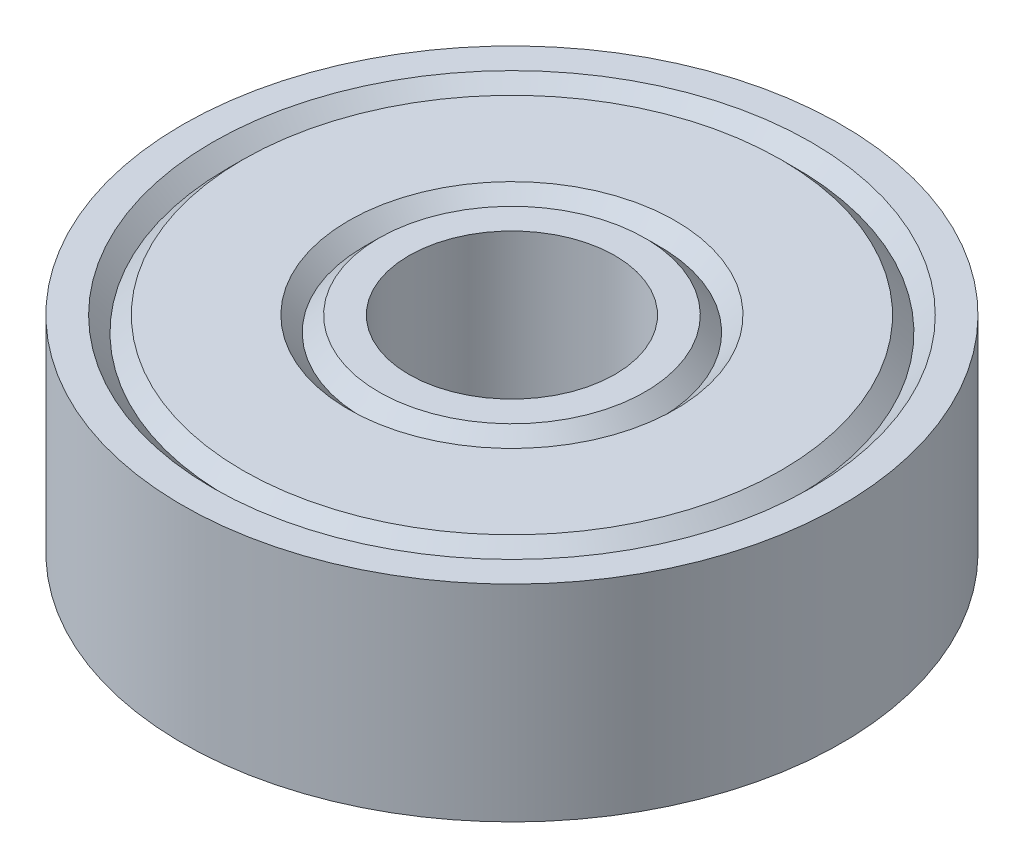
ISO-10303-21;
HEADER;
FILE_DESCRIPTION(('STEP AP214'),'2;1');
FILE_NAME('part.step','',(''),(''),'','','');
FILE_SCHEMA(('AUTOMOTIVE_DESIGN { 1 0 10303 214 1 1 1 1 }'));
ENDSEC;
DATA;
#1=APPLICATION_CONTEXT('core data for automotive mechanical design processes');
#2=APPLICATION_PROTOCOL_DEFINITION('international standard','automotive_design',2000,#1);
#3=PRODUCT_CONTEXT('',#1,'mechanical');
#4=PRODUCT('Part','Part','',(#3));
#5=PRODUCT_RELATED_PRODUCT_CATEGORY('part','',(#4));
#6=PRODUCT_DEFINITION_FORMATION('','',#4);
#7=PRODUCT_DEFINITION_CONTEXT('part definition',#1,'design');
#8=PRODUCT_DEFINITION('design','',#6,#7);
#9=PRODUCT_DEFINITION_SHAPE('','',#8);
#10=(LENGTH_UNIT() NAMED_UNIT(*) SI_UNIT(.MILLI.,.METRE.));
#11=(NAMED_UNIT(*) PLANE_ANGLE_UNIT() SI_UNIT($,.RADIAN.));
#12=(NAMED_UNIT(*) SI_UNIT($,.STERADIAN.) SOLID_ANGLE_UNIT());
#13=UNCERTAINTY_MEASURE_WITH_UNIT(LENGTH_MEASURE(1.E-05),#10,'distance_accuracy_value','');
#14=(GEOMETRIC_REPRESENTATION_CONTEXT(3) GLOBAL_UNCERTAINTY_ASSIGNED_CONTEXT((#13)) GLOBAL_UNIT_ASSIGNED_CONTEXT((#10,
#11,#12)) REPRESENTATION_CONTEXT('',''));
#15=CARTESIAN_POINT('',(0.,0.,0.));
#16=DIRECTION('',(0.,0.,1.));
#17=DIRECTION('',(1.,0.,0.));
#18=AXIS2_PLACEMENT_3D('',#15,#16,#17);
#19=CARTESIAN_POINT('',(0.,2.5,0.));
#20=DIRECTION('',(0.,1.,0.));
#21=DIRECTION('',(-1.,0.,0.));
#22=AXIS2_PLACEMENT_3D('',#19,#20,#21);
#23=CYLINDRICAL_SURFACE('',#22,2.5);
#24=CARTESIAN_POINT('',(0.,2.5,0.));
#25=DIRECTION('',(0.,1.,0.));
#26=DIRECTION('',(-1.,0.,0.));
#27=AXIS2_PLACEMENT_3D('',#24,#25,#26);
#28=CIRCLE('',#27,2.5);
#29=CARTESIAN_POINT('',(-2.5,2.5,0.));
#30=VERTEX_POINT('',#29);
#31=EDGE_CURVE('E83',#30,#30,#28,.T.);
#32=ORIENTED_EDGE('',*,*,#31,.T.);
#33=EDGE_LOOP('',(#32));
#34=FACE_BOUND('',#33,.T.);
#35=CARTESIAN_POINT('',(0.,-2.5,0.));
#36=DIRECTION('',(0.,1.,0.));
#37=DIRECTION('',(-1.,0.,0.));
#38=AXIS2_PLACEMENT_3D('',#35,#36,#37);
#39=CIRCLE('',#38,2.5);
#40=CARTESIAN_POINT('',(-2.5,-2.5,0.));
#41=VERTEX_POINT('',#40);
#42=EDGE_CURVE('E10',#41,#41,#39,.T.);
#43=ORIENTED_EDGE('',*,*,#42,.F.);
#44=EDGE_LOOP('',(#43));
#45=FACE_BOUND('',#44,.T.);
#46=ADVANCED_FACE('F31',(#34,#45),#23,.F.);
#47=CARTESIAN_POINT('',(-2.5,-2.5,0.));
#48=DIRECTION('',(0.,-1.,0.));
#49=DIRECTION('',(1.,0.,0.));
#50=AXIS2_PLACEMENT_3D('',#47,#48,#49);
#51=PLANE('',#50);
#52=ORIENTED_EDGE('',*,*,#42,.T.);
#53=EDGE_LOOP('',(#52));
#54=FACE_BOUND('',#53,.T.);
#55=CARTESIAN_POINT('',(0.,-2.5,0.));
#56=DIRECTION('',(0.,1.,0.));
#57=DIRECTION('',(-1.,0.,0.));
#58=AXIS2_PLACEMENT_3D('',#55,#56,#57);
#59=CIRCLE('',#58,3.23333333333334);
#60=CARTESIAN_POINT('',(-3.23333333333334,-2.5,0.));
#61=VERTEX_POINT('',#60);
#62=EDGE_CURVE('E37',#61,#61,#59,.T.);
#63=ORIENTED_EDGE('',*,*,#62,.F.);
#64=EDGE_LOOP('',(#63));
#65=FACE_BOUND('',#64,.T.);
#66=ADVANCED_FACE('F101',(#54,#65),#51,.T.);
#67=CARTESIAN_POINT('',(0.,-2.13333333333333,0.));
#68=DIRECTION('',(0.,1.,0.));
#69=DIRECTION('',(-1.,0.,0.));
#70=AXIS2_PLACEMENT_3D('',#67,#68,#69);
#71=CONICAL_SURFACE('',#70,3.6,0.785398163397449);
#72=ORIENTED_EDGE('',*,*,#62,.T.);
#73=EDGE_LOOP('',(#72));
#74=FACE_BOUND('',#73,.T.);
#75=CARTESIAN_POINT('',(0.,-2.13333333333333,0.));
#76=DIRECTION('',(0.,1.,0.));
#77=DIRECTION('',(-1.,0.,0.));
#78=AXIS2_PLACEMENT_3D('',#75,#76,#77);
#79=CIRCLE('',#78,3.6);
#80=CARTESIAN_POINT('',(-3.6,-2.13333333333333,0.));
#81=VERTEX_POINT('',#80);
#82=EDGE_CURVE('E41',#81,#81,#79,.T.);
#83=ORIENTED_EDGE('',*,*,#82,.F.);
#84=EDGE_LOOP('',(#83));
#85=FACE_BOUND('',#84,.T.);
#86=ADVANCED_FACE('F105',(#74,#85),#71,.T.);
#87=CARTESIAN_POINT('',(0.,-2.5,0.));
#88=DIRECTION('',(0.,-1.,0.));
#89=DIRECTION('',(1.,0.,0.));
#90=AXIS2_PLACEMENT_3D('',#87,#88,#89);
#91=CONICAL_SURFACE('',#90,3.96666666666667,0.785398163397448);
#92=ORIENTED_EDGE('',*,*,#82,.T.);
#93=EDGE_LOOP('',(#92));
#94=FACE_BOUND('',#93,.T.);
#95=CARTESIAN_POINT('',(0.,-2.5,0.));
#96=DIRECTION('',(0.,1.,0.));
#97=DIRECTION('',(-1.,0.,0.));
#98=AXIS2_PLACEMENT_3D('',#95,#96,#97);
#99=CIRCLE('',#98,3.96666666666667);
#100=CARTESIAN_POINT('',(-3.96666666666667,-2.5,0.));
#101=VERTEX_POINT('',#100);
#102=EDGE_CURVE('E45',#101,#101,#99,.T.);
#103=ORIENTED_EDGE('',*,*,#102,.F.);
#104=EDGE_LOOP('',(#103));
#105=FACE_BOUND('',#104,.T.);
#106=ADVANCED_FACE('F109',(#94,#105),#91,.F.);
#107=CARTESIAN_POINT('',(-3.96666666666667,-2.5,0.));
#108=DIRECTION('',(0.,-1.,0.));
#109=DIRECTION('',(1.,0.,0.));
#110=AXIS2_PLACEMENT_3D('',#107,#108,#109);
#111=PLANE('',#110);
#112=ORIENTED_EDGE('',*,*,#102,.T.);
#113=EDGE_LOOP('',(#112));
#114=FACE_BOUND('',#113,.T.);
#115=CARTESIAN_POINT('',(0.,-2.5,0.));
#116=DIRECTION('',(0.,1.,0.));
#117=DIRECTION('',(-1.,0.,0.));
#118=AXIS2_PLACEMENT_3D('',#115,#116,#117);
#119=CIRCLE('',#118,6.53333333333333);
#120=CARTESIAN_POINT('',(-6.53333333333333,-2.5,0.));
#121=VERTEX_POINT('',#120);
#122=EDGE_CURVE('E50',#121,#121,#119,.T.);
#123=ORIENTED_EDGE('',*,*,#122,.F.);
#124=EDGE_LOOP('',(#123));
#125=FACE_BOUND('',#124,.T.);
#126=ADVANCED_FACE('F115',(#114,#125),#111,.T.);
#127=CARTESIAN_POINT('',(0.,-2.13333333333333,0.));
#128=DIRECTION('',(0.,1.,0.));
#129=DIRECTION('',(-1.,0.,0.));
#130=AXIS2_PLACEMENT_3D('',#127,#128,#129);
#131=CONICAL_SURFACE('',#130,6.9,0.785398163397447);
#132=ORIENTED_EDGE('',*,*,#122,.T.);
#133=EDGE_LOOP('',(#132));
#134=FACE_BOUND('',#133,.T.);
#135=CARTESIAN_POINT('',(0.,-2.13333333333333,0.));
#136=DIRECTION('',(0.,1.,0.));
#137=DIRECTION('',(-1.,0.,0.));
#138=AXIS2_PLACEMENT_3D('',#135,#136,#137);
#139=CIRCLE('',#138,6.9);
#140=CARTESIAN_POINT('',(-6.9,-2.13333333333333,0.));
#141=VERTEX_POINT('',#140);
#142=EDGE_CURVE('E53',#141,#141,#139,.T.);
#143=ORIENTED_EDGE('',*,*,#142,.F.);
#144=EDGE_LOOP('',(#143));
#145=FACE_BOUND('',#144,.T.);
#146=ADVANCED_FACE('F119',(#134,#145),#131,.T.);
#147=CARTESIAN_POINT('',(0.,-2.5,0.));
#148=DIRECTION('',(0.,-1.,0.));
#149=DIRECTION('',(1.,0.,0.));
#150=AXIS2_PLACEMENT_3D('',#147,#148,#149);
#151=CONICAL_SURFACE('',#150,7.26666666666667,0.785398163397446);
#152=ORIENTED_EDGE('',*,*,#142,.T.);
#153=EDGE_LOOP('',(#152));
#154=FACE_BOUND('',#153,.T.);
#155=CARTESIAN_POINT('',(0.,-2.5,0.));
#156=DIRECTION('',(0.,1.,0.));
#157=DIRECTION('',(-1.,0.,0.));
#158=AXIS2_PLACEMENT_3D('',#155,#156,#157);
#159=CIRCLE('',#158,7.26666666666667);
#160=CARTESIAN_POINT('',(-7.26666666666666,-2.5,0.));
#161=VERTEX_POINT('',#160);
#162=EDGE_CURVE('E56',#161,#161,#159,.T.);
#163=ORIENTED_EDGE('',*,*,#162,.F.);
#164=EDGE_LOOP('',(#163));
#165=FACE_BOUND('',#164,.T.);
#166=ADVANCED_FACE('F123',(#154,#165),#151,.F.);
#167=CARTESIAN_POINT('',(-7.26666666666666,-2.5,0.));
#168=DIRECTION('',(0.,-1.,0.));
#169=DIRECTION('',(1.,0.,0.));
#170=AXIS2_PLACEMENT_3D('',#167,#168,#169);
#171=PLANE('',#170);
#172=ORIENTED_EDGE('',*,*,#162,.T.);
#173=EDGE_LOOP('',(#172));
#174=FACE_BOUND('',#173,.T.);
#175=CARTESIAN_POINT('',(0.,-2.5,0.));
#176=DIRECTION('',(0.,1.,0.));
#177=DIRECTION('',(-1.,0.,0.));
#178=AXIS2_PLACEMENT_3D('',#175,#176,#177);
#179=CIRCLE('',#178,8.);
#180=CARTESIAN_POINT('',(-8.,-2.5,0.));
#181=VERTEX_POINT('',#180);
#182=EDGE_CURVE('E59',#181,#181,#179,.T.);
#183=ORIENTED_EDGE('',*,*,#182,.F.);
#184=EDGE_LOOP('',(#183));
#185=FACE_BOUND('',#184,.T.);
#186=ADVANCED_FACE('F127',(#174,#185),#171,.T.);
#187=CARTESIAN_POINT('',(0.,2.5,0.));
#188=DIRECTION('',(0.,1.,0.));
#189=DIRECTION('',(-1.,0.,0.));
#190=AXIS2_PLACEMENT_3D('',#187,#188,#189);
#191=CYLINDRICAL_SURFACE('',#190,8.);
#192=ORIENTED_EDGE('',*,*,#182,.T.);
#193=EDGE_LOOP('',(#192));
#194=FACE_BOUND('',#193,.T.);
#195=CARTESIAN_POINT('',(0.,2.5,0.));
#196=DIRECTION('',(0.,1.,0.));
#197=DIRECTION('',(-1.,0.,0.));
#198=AXIS2_PLACEMENT_3D('',#195,#196,#197);
#199=CIRCLE('',#198,8.);
#200=CARTESIAN_POINT('',(-8.,2.5,0.));
#201=VERTEX_POINT('',#200);
#202=EDGE_CURVE('E62',#201,#201,#199,.T.);
#203=ORIENTED_EDGE('',*,*,#202,.F.);
#204=EDGE_LOOP('',(#203));
#205=FACE_BOUND('',#204,.T.);
#206=ADVANCED_FACE('F131',(#194,#205),#191,.T.);
#207=CARTESIAN_POINT('',(-7.26666666666667,2.5,0.));
#208=DIRECTION('',(0.,1.,0.));
#209=DIRECTION('',(-1.,0.,0.));
#210=AXIS2_PLACEMENT_3D('',#207,#208,#209);
#211=PLANE('',#210);
#212=ORIENTED_EDGE('',*,*,#202,.T.);
#213=EDGE_LOOP('',(#212));
#214=FACE_BOUND('',#213,.T.);
#215=CARTESIAN_POINT('',(0.,2.5,0.));
#216=DIRECTION('',(0.,1.,0.));
#217=DIRECTION('',(-1.,0.,0.));
#218=AXIS2_PLACEMENT_3D('',#215,#216,#217);
#219=CIRCLE('',#218,7.26666666666667);
#220=CARTESIAN_POINT('',(-7.26666666666667,2.5,0.));
#221=VERTEX_POINT('',#220);
#222=EDGE_CURVE('E65',#221,#221,#219,.T.);
#223=ORIENTED_EDGE('',*,*,#222,.F.);
#224=EDGE_LOOP('',(#223));
#225=FACE_BOUND('',#224,.T.);
#226=ADVANCED_FACE('F135',(#214,#225),#211,.T.);
#227=CARTESIAN_POINT('',(0.,2.13333333333333,0.));
#228=DIRECTION('',(0.,1.,0.));
#229=DIRECTION('',(-1.,0.,0.));
#230=AXIS2_PLACEMENT_3D('',#227,#228,#229);
#231=CONICAL_SURFACE('',#230,6.9,0.78539816339745);
#232=ORIENTED_EDGE('',*,*,#222,.T.);
#233=EDGE_LOOP('',(#232));
#234=FACE_BOUND('',#233,.T.);
#235=CARTESIAN_POINT('',(0.,2.13333333333333,0.));
#236=DIRECTION('',(0.,1.,0.));
#237=DIRECTION('',(-1.,0.,0.));
#238=AXIS2_PLACEMENT_3D('',#235,#236,#237);
#239=CIRCLE('',#238,6.9);
#240=CARTESIAN_POINT('',(-6.9,2.13333333333333,0.));
#241=VERTEX_POINT('',#240);
#242=EDGE_CURVE('E68',#241,#241,#239,.T.);
#243=ORIENTED_EDGE('',*,*,#242,.F.);
#244=EDGE_LOOP('',(#243));
#245=FACE_BOUND('',#244,.T.);
#246=ADVANCED_FACE('F139',(#234,#245),#231,.F.);
#247=CARTESIAN_POINT('',(0.,2.5,0.));
#248=DIRECTION('',(0.,-1.,0.));
#249=DIRECTION('',(1.,0.,0.));
#250=AXIS2_PLACEMENT_3D('',#247,#248,#249);
#251=CONICAL_SURFACE('',#250,6.53333333333333,0.785398163397448);
#252=ORIENTED_EDGE('',*,*,#242,.T.);
#253=EDGE_LOOP('',(#252));
#254=FACE_BOUND('',#253,.T.);
#255=CARTESIAN_POINT('',(0.,2.5,0.));
#256=DIRECTION('',(0.,1.,0.));
#257=DIRECTION('',(-1.,0.,0.));
#258=AXIS2_PLACEMENT_3D('',#255,#256,#257);
#259=CIRCLE('',#258,6.53333333333333);
#260=CARTESIAN_POINT('',(-6.53333333333333,2.5,0.));
#261=VERTEX_POINT('',#260);
#262=EDGE_CURVE('E71',#261,#261,#259,.T.);
#263=ORIENTED_EDGE('',*,*,#262,.F.);
#264=EDGE_LOOP('',(#263));
#265=FACE_BOUND('',#264,.T.);
#266=ADVANCED_FACE('F143',(#254,#265),#251,.T.);
#267=CARTESIAN_POINT('',(-3.96666666666667,2.5,0.));
#268=DIRECTION('',(0.,1.,0.));
#269=DIRECTION('',(-1.,0.,0.));
#270=AXIS2_PLACEMENT_3D('',#267,#268,#269);
#271=PLANE('',#270);
#272=ORIENTED_EDGE('',*,*,#262,.T.);
#273=EDGE_LOOP('',(#272));
#274=FACE_BOUND('',#273,.T.);
#275=CARTESIAN_POINT('',(0.,2.5,0.));
#276=DIRECTION('',(0.,1.,0.));
#277=DIRECTION('',(-1.,0.,0.));
#278=AXIS2_PLACEMENT_3D('',#275,#276,#277);
#279=CIRCLE('',#278,3.96666666666667);
#280=CARTESIAN_POINT('',(-3.96666666666667,2.5,0.));
#281=VERTEX_POINT('',#280);
#282=EDGE_CURVE('E74',#281,#281,#279,.T.);
#283=ORIENTED_EDGE('',*,*,#282,.F.);
#284=EDGE_LOOP('',(#283));
#285=FACE_BOUND('',#284,.T.);
#286=ADVANCED_FACE('F147',(#274,#285),#271,.T.);
#287=CARTESIAN_POINT('',(0.,2.13333333333333,0.));
#288=DIRECTION('',(0.,1.,0.));
#289=DIRECTION('',(-1.,0.,0.));
#290=AXIS2_PLACEMENT_3D('',#287,#288,#289);
#291=CONICAL_SURFACE('',#290,3.6,0.785398163397448);
#292=ORIENTED_EDGE('',*,*,#282,.T.);
#293=EDGE_LOOP('',(#292));
#294=FACE_BOUND('',#293,.T.);
#295=CARTESIAN_POINT('',(0.,2.13333333333333,0.));
#296=DIRECTION('',(0.,1.,0.));
#297=DIRECTION('',(-1.,0.,0.));
#298=AXIS2_PLACEMENT_3D('',#295,#296,#297);
#299=CIRCLE('',#298,3.6);
#300=CARTESIAN_POINT('',(-3.6,2.13333333333333,0.));
#301=VERTEX_POINT('',#300);
#302=EDGE_CURVE('E77',#301,#301,#299,.T.);
#303=ORIENTED_EDGE('',*,*,#302,.F.);
#304=EDGE_LOOP('',(#303));
#305=FACE_BOUND('',#304,.T.);
#306=ADVANCED_FACE('F97',(#294,#305),#291,.F.);
#307=CARTESIAN_POINT('',(0.,2.5,0.));
#308=DIRECTION('',(0.,-1.,0.));
#309=DIRECTION('',(1.,0.,0.));
#310=AXIS2_PLACEMENT_3D('',#307,#308,#309);
#311=CONICAL_SURFACE('',#310,3.23333333333334,0.785398163397447);
#312=ORIENTED_EDGE('',*,*,#302,.T.);
#313=EDGE_LOOP('',(#312));
#314=FACE_BOUND('',#313,.T.);
#315=CARTESIAN_POINT('',(0.,2.5,0.));
#316=DIRECTION('',(0.,1.,0.));
#317=DIRECTION('',(-1.,0.,0.));
#318=AXIS2_PLACEMENT_3D('',#315,#316,#317);
#319=CIRCLE('',#318,3.23333333333334);
#320=CARTESIAN_POINT('',(-3.23333333333334,2.5,0.));
#321=VERTEX_POINT('',#320);
#322=EDGE_CURVE('E80',#321,#321,#319,.T.);
#323=ORIENTED_EDGE('',*,*,#322,.F.);
#324=EDGE_LOOP('',(#323));
#325=FACE_BOUND('',#324,.T.);
#326=ADVANCED_FACE('F91',(#314,#325),#311,.T.);
#327=CARTESIAN_POINT('',(-2.5,2.5,0.));
#328=DIRECTION('',(0.,1.,0.));
#329=DIRECTION('',(-1.,0.,0.));
#330=AXIS2_PLACEMENT_3D('',#327,#328,#329);
#331=PLANE('',#330);
#332=ORIENTED_EDGE('',*,*,#322,.T.);
#333=EDGE_LOOP('',(#332));
#334=FACE_BOUND('',#333,.T.);
#335=ORIENTED_EDGE('',*,*,#31,.F.);
#336=EDGE_LOOP('',(#335));
#337=FACE_BOUND('',#336,.T.);
#338=ADVANCED_FACE('F89',(#334,#337),#331,.T.);
#339=CLOSED_SHELL('',(#46,#66,#86,#106,#126,#146,#166,#186,#206,#226,#246,#266,#286,#306,#326,#338));
#340=MANIFOLD_SOLID_BREP('B2',#339);
#341=ADVANCED_BREP_SHAPE_REPRESENTATION('',(#18,#340),#14);
#342=SHAPE_DEFINITION_REPRESENTATION(#9,#341);
ENDSEC;
END-ISO-10303-21;
